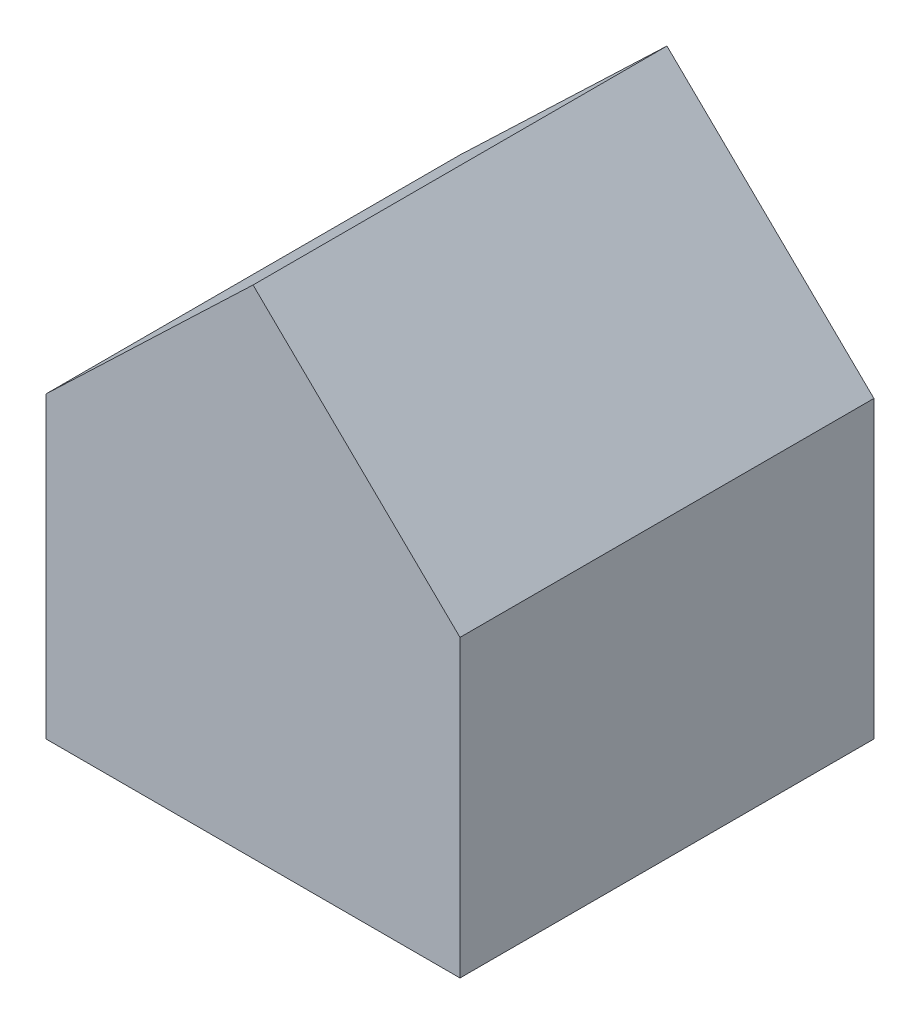
ISO-10303-21;
HEADER;
FILE_DESCRIPTION(('STEP AP214'),'2;1');
FILE_NAME('part.step','',(''),(''),'','','');
FILE_SCHEMA(('AUTOMOTIVE_DESIGN { 1 0 10303 214 1 1 1 1 }'));
ENDSEC;
DATA;
#1=APPLICATION_CONTEXT('core data for automotive mechanical design processes');
#2=APPLICATION_PROTOCOL_DEFINITION('international standard','automotive_design',2000,#1);
#3=PRODUCT_CONTEXT('',#1,'mechanical');
#4=PRODUCT('Part','Part','',(#3));
#5=PRODUCT_RELATED_PRODUCT_CATEGORY('part','',(#4));
#6=PRODUCT_DEFINITION_FORMATION('','',#4);
#7=PRODUCT_DEFINITION_CONTEXT('part definition',#1,'design');
#8=PRODUCT_DEFINITION('design','',#6,#7);
#9=PRODUCT_DEFINITION_SHAPE('','',#8);
#10=(LENGTH_UNIT() NAMED_UNIT(*) SI_UNIT(.MILLI.,.METRE.));
#11=(NAMED_UNIT(*) PLANE_ANGLE_UNIT() SI_UNIT($,.RADIAN.));
#12=(NAMED_UNIT(*) SI_UNIT($,.STERADIAN.) SOLID_ANGLE_UNIT());
#13=UNCERTAINTY_MEASURE_WITH_UNIT(LENGTH_MEASURE(1.E-05),#10,'distance_accuracy_value','');
#14=(GEOMETRIC_REPRESENTATION_CONTEXT(3) GLOBAL_UNCERTAINTY_ASSIGNED_CONTEXT((#13)) GLOBAL_UNIT_ASSIGNED_CONTEXT((#10,
#11,#12)) REPRESENTATION_CONTEXT('',''));
#15=CARTESIAN_POINT('',(0.,0.,0.));
#16=DIRECTION('',(0.,0.,1.));
#17=DIRECTION('',(1.,0.,0.));
#18=AXIS2_PLACEMENT_3D('',#15,#16,#17);
#19=CARTESIAN_POINT('',(0.922994888155918,36.,101.476956021048));
#20=DIRECTION('',(0.690881394174608,-0.722968117681098,0.));
#21=DIRECTION('',(0.722968117681098,0.690881394174608,0.));
#22=AXIS2_PLACEMENT_3D('',#19,#20,#21);
#23=PLANE('',#22);
#24=DIRECTION('',(-0.722968117681098,-0.690881394174608,0.));
#25=VECTOR('',#24,1.);
#26=CARTESIAN_POINT('',(-6.91724859959433,28.5077216836904,14.1888076910358));
#27=LINE('',#26,#25);
#28=CARTESIAN_POINT('',(0.922994888155918,36.,14.1888076910358));
#29=VERTEX_POINT('',#28);
#30=CARTESIAN_POINT('',(-14.0770051118441,21.6657290146364,14.1888076910358));
#31=VERTEX_POINT('',#30);
#32=EDGE_CURVE('E49',#29,#31,#27,.T.);
#33=ORIENTED_EDGE('',*,*,#32,.F.);
#34=DIRECTION('',(0.,0.,-1.));
#35=VECTOR('',#34,1.);
#36=CARTESIAN_POINT('',(0.922994888155918,36.,101.476956021048));
#37=LINE('',#36,#35);
#38=CARTESIAN_POINT('',(0.922994888155918,36.,-15.8111923089642));
#39=VERTEX_POINT('',#38);
#40=EDGE_CURVE('E97',#29,#39,#37,.T.);
#41=ORIENTED_EDGE('',*,*,#40,.T.);
#42=DIRECTION('',(0.722968117681098,0.690881394174608,0.));
#43=VECTOR('',#42,1.);
#44=CARTESIAN_POINT('',(-6.91724859959433,28.5077216836904,-15.8111923089642));
#45=LINE('',#44,#43);
#46=CARTESIAN_POINT('',(-14.0770051118441,21.6657290146364,-15.8111923089642));
#47=VERTEX_POINT('',#46);
#48=EDGE_CURVE('E82',#47,#39,#45,.T.);
#49=ORIENTED_EDGE('',*,*,#48,.F.);
#50=DIRECTION('',(0.,0.,-1.));
#51=VECTOR('',#50,1.);
#52=CARTESIAN_POINT('',(-14.0770051118441,21.6657290146364,101.476956021048));
#53=LINE('',#52,#51);
#54=EDGE_CURVE('E98',#31,#47,#53,.T.);
#55=ORIENTED_EDGE('',*,*,#54,.F.);
#56=EDGE_LOOP('',(#33,#41,#49,#55));
#57=FACE_BOUND('',#56,.T.);
#58=ADVANCED_FACE('F35',(#57),#23,.F.);
#59=CARTESIAN_POINT('',(0.922994888155918,36.,101.476956021048));
#60=DIRECTION('',(0.697989898134286,0.716107605114266,0.));
#61=DIRECTION('',(-0.716107605114266,0.697989898134286,0.));
#62=AXIS2_PLACEMENT_3D('',#59,#60,#61);
#63=PLANE('',#62);
#64=ORIENTED_EDGE('',*,*,#40,.F.);
#65=DIRECTION('',(0.716107605114266,-0.697989898134286,0.));
#66=VECTOR('',#65,1.);
#67=CARTESIAN_POINT('',(-6.76915664338141,43.4975381152034,14.1888076910358));
#68=LINE('',#67,#66);
#69=CARTESIAN_POINT('',(15.9229948881559,21.3795038661213,14.1888076910358));
#70=VERTEX_POINT('',#69);
#71=EDGE_CURVE('E91',#29,#70,#68,.T.);
#72=ORIENTED_EDGE('',*,*,#71,.T.);
#73=DIRECTION('',(0.,0.,-1.));
#74=VECTOR('',#73,1.);
#75=CARTESIAN_POINT('',(15.9229948881559,21.3795038661213,-15.8111923089642));
#76=LINE('',#75,#74);
#77=CARTESIAN_POINT('',(15.9229948881559,21.3795038661213,-15.8111923089642));
#78=VERTEX_POINT('',#77);
#79=EDGE_CURVE('E57',#70,#78,#76,.T.);
#80=ORIENTED_EDGE('',*,*,#79,.T.);
#81=DIRECTION('',(-0.716107605114266,0.697989898134286,0.));
#82=VECTOR('',#81,1.);
#83=CARTESIAN_POINT('',(-6.76915664338141,43.4975381152034,-15.8111923089642));
#84=LINE('',#83,#82);
#85=EDGE_CURVE('E85',#78,#39,#84,.T.);
#86=ORIENTED_EDGE('',*,*,#85,.T.);
#87=EDGE_LOOP('',(#64,#72,#80,#86));
#88=FACE_BOUND('',#87,.T.);
#89=ADVANCED_FACE('F95',(#88),#63,.T.);
#90=CARTESIAN_POINT('',(-14.0770051118441,36.,14.1888076910358));
#91=DIRECTION('',(0.,0.,-1.));
#92=DIRECTION('',(-1.,0.,0.));
#93=AXIS2_PLACEMENT_3D('',#90,#91,#92);
#94=PLANE('',#93);
#95=ORIENTED_EDGE('',*,*,#71,.F.);
#96=ORIENTED_EDGE('',*,*,#32,.T.);
#97=DIRECTION('',(0.,-1.,0.));
#98=VECTOR('',#97,1.);
#99=CARTESIAN_POINT('',(-14.0770051118441,36.,14.1888076910358));
#100=LINE('',#99,#98);
#101=CARTESIAN_POINT('',(-14.0770051118441,0.,14.1888076910358));
#102=VERTEX_POINT('',#101);
#103=EDGE_CURVE('E11',#31,#102,#100,.T.);
#104=ORIENTED_EDGE('',*,*,#103,.T.);
#105=DIRECTION('',(1.,0.,0.));
#106=VECTOR('',#105,1.);
#107=CARTESIAN_POINT('',(-14.0770051118441,0.,14.1888076910358));
#108=LINE('',#107,#106);
#109=CARTESIAN_POINT('',(15.9229948881559,0.,14.1888076910358));
#110=VERTEX_POINT('',#109);
#111=EDGE_CURVE('E109',#102,#110,#108,.T.);
#112=ORIENTED_EDGE('',*,*,#111,.T.);
#113=DIRECTION('',(0.,-1.,0.));
#114=VECTOR('',#113,1.);
#115=CARTESIAN_POINT('',(15.9229948881559,36.,14.1888076910358));
#116=LINE('',#115,#114);
#117=EDGE_CURVE('E43',#70,#110,#116,.T.);
#118=ORIENTED_EDGE('',*,*,#117,.F.);
#119=EDGE_LOOP('',(#95,#96,#104,#112,#118));
#120=FACE_BOUND('',#119,.T.);
#121=ADVANCED_FACE('F123',(#120),#94,.F.);
#122=CARTESIAN_POINT('',(15.9229948881559,36.,-15.8111923089642));
#123=DIRECTION('',(-1.,0.,0.));
#124=DIRECTION('',(0.,0.,1.));
#125=AXIS2_PLACEMENT_3D('',#122,#123,#124);
#126=PLANE('',#125);
#127=ORIENTED_EDGE('',*,*,#79,.F.);
#128=ORIENTED_EDGE('',*,*,#117,.T.);
#129=DIRECTION('',(0.,0.,-1.));
#130=VECTOR('',#129,1.);
#131=CARTESIAN_POINT('',(15.9229948881559,0.,-15.8111923089642));
#132=LINE('',#131,#130);
#133=CARTESIAN_POINT('',(15.9229948881559,0.,-15.8111923089642));
#134=VERTEX_POINT('',#133);
#135=EDGE_CURVE('E112',#110,#134,#132,.T.);
#136=ORIENTED_EDGE('',*,*,#135,.T.);
#137=DIRECTION('',(0.,-1.,0.));
#138=VECTOR('',#137,1.);
#139=CARTESIAN_POINT('',(15.9229948881559,36.,-15.8111923089642));
#140=LINE('',#139,#138);
#141=EDGE_CURVE('E118',#78,#134,#140,.T.);
#142=ORIENTED_EDGE('',*,*,#141,.F.);
#143=EDGE_LOOP('',(#127,#128,#136,#142));
#144=FACE_BOUND('',#143,.T.);
#145=ADVANCED_FACE('F119',(#144),#126,.F.);
#146=CARTESIAN_POINT('',(-14.0770051118441,36.,-15.8111923089642));
#147=DIRECTION('',(0.,0.,1.));
#148=DIRECTION('',(1.,0.,0.));
#149=AXIS2_PLACEMENT_3D('',#146,#147,#148);
#150=PLANE('',#149);
#151=DIRECTION('',(0.,-1.,0.));
#152=VECTOR('',#151,1.);
#153=CARTESIAN_POINT('',(-14.0770051118441,36.,-15.8111923089642));
#154=LINE('',#153,#152);
#155=CARTESIAN_POINT('',(-14.0770051118441,0.,-15.8111923089642));
#156=VERTEX_POINT('',#155);
#157=EDGE_CURVE('E87',#47,#156,#154,.T.);
#158=ORIENTED_EDGE('',*,*,#157,.F.);
#159=ORIENTED_EDGE('',*,*,#48,.T.);
#160=ORIENTED_EDGE('',*,*,#85,.F.);
#161=ORIENTED_EDGE('',*,*,#141,.T.);
#162=DIRECTION('',(-1.,0.,0.));
#163=VECTOR('',#162,1.);
#164=CARTESIAN_POINT('',(-14.0770051118441,0.,-15.8111923089642));
#165=LINE('',#164,#163);
#166=EDGE_CURVE('E115',#134,#156,#165,.T.);
#167=ORIENTED_EDGE('',*,*,#166,.T.);
#168=EDGE_LOOP('',(#158,#159,#160,#161,#167));
#169=FACE_BOUND('',#168,.T.);
#170=ADVANCED_FACE('F84',(#169),#150,.F.);
#171=CARTESIAN_POINT('',(-14.0770051118441,36.,-15.8111923089642));
#172=DIRECTION('',(1.,0.,0.));
#173=DIRECTION('',(0.,0.,-1.));
#174=AXIS2_PLACEMENT_3D('',#171,#172,#173);
#175=PLANE('',#174);
#176=ORIENTED_EDGE('',*,*,#103,.F.);
#177=ORIENTED_EDGE('',*,*,#54,.T.);
#178=ORIENTED_EDGE('',*,*,#157,.T.);
#179=DIRECTION('',(0.,0.,1.));
#180=VECTOR('',#179,1.);
#181=CARTESIAN_POINT('',(-14.0770051118441,0.,-15.8111923089642));
#182=LINE('',#181,#180);
#183=EDGE_CURVE('E106',#156,#102,#182,.T.);
#184=ORIENTED_EDGE('',*,*,#183,.T.);
#185=EDGE_LOOP('',(#176,#177,#178,#184));
#186=FACE_BOUND('',#185,.T.);
#187=ADVANCED_FACE('F37',(#186),#175,.F.);
#188=CARTESIAN_POINT('',(0.,0.,0.));
#189=DIRECTION('',(0.,1.,0.));
#190=DIRECTION('',(0.,0.,1.));
#191=AXIS2_PLACEMENT_3D('',#188,#189,#190);
#192=PLANE('',#191);
#193=ORIENTED_EDGE('',*,*,#183,.F.);
#194=ORIENTED_EDGE('',*,*,#166,.F.);
#195=ORIENTED_EDGE('',*,*,#135,.F.);
#196=ORIENTED_EDGE('',*,*,#111,.F.);
#197=EDGE_LOOP('',(#193,#194,#195,#196));
#198=FACE_BOUND('',#197,.T.);
#199=ADVANCED_FACE('F126',(#198),#192,.F.);
#200=CLOSED_SHELL('',(#58,#89,#121,#145,#170,#187,#199));
#201=MANIFOLD_SOLID_BREP('B2',#200);
#202=ADVANCED_BREP_SHAPE_REPRESENTATION('',(#18,#201),#14);
#203=SHAPE_DEFINITION_REPRESENTATION(#9,#202);
ENDSEC;
END-ISO-10303-21;
